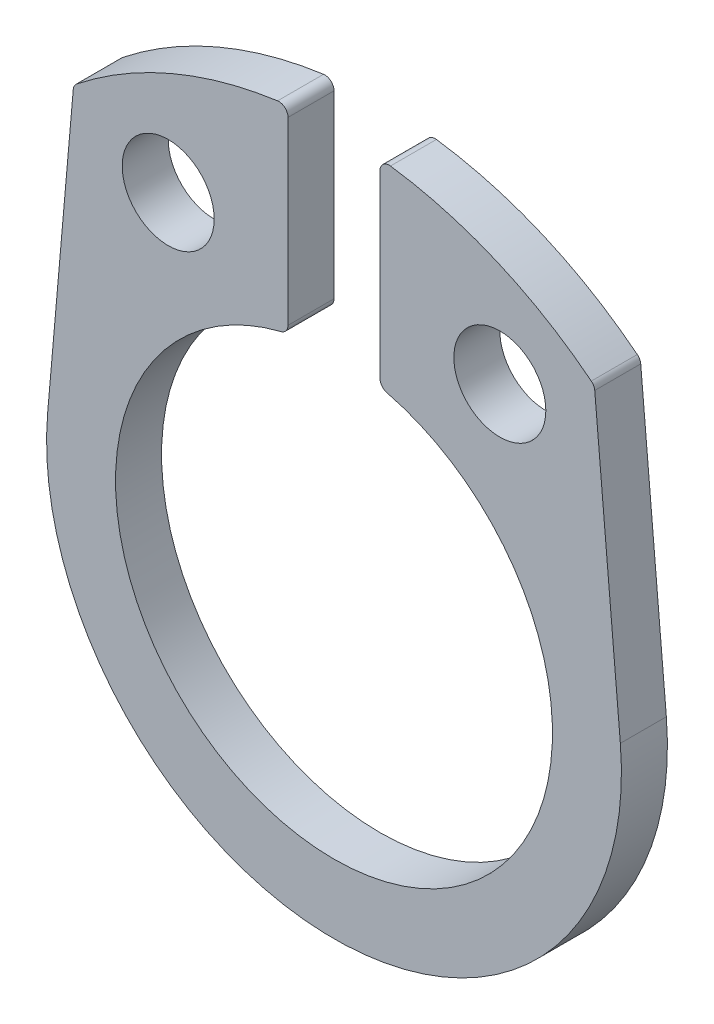
ISO-10303-21;
HEADER;
FILE_DESCRIPTION(('STEP AP214'),'2;1');
FILE_NAME('part.step','',(''),(''),'','','');
FILE_SCHEMA(('AUTOMOTIVE_DESIGN { 1 0 10303 214 1 1 1 1 }'));
ENDSEC;
DATA;
#1=APPLICATION_CONTEXT('core data for automotive mechanical design processes');
#2=APPLICATION_PROTOCOL_DEFINITION('international standard','automotive_design',2000,#1);
#3=PRODUCT_CONTEXT('',#1,'mechanical');
#4=PRODUCT('Part','Part','',(#3));
#5=PRODUCT_RELATED_PRODUCT_CATEGORY('part','',(#4));
#6=PRODUCT_DEFINITION_FORMATION('','',#4);
#7=PRODUCT_DEFINITION_CONTEXT('part definition',#1,'design');
#8=PRODUCT_DEFINITION('design','',#6,#7);
#9=PRODUCT_DEFINITION_SHAPE('','',#8);
#10=(LENGTH_UNIT() NAMED_UNIT(*) SI_UNIT(.MILLI.,.METRE.));
#11=(NAMED_UNIT(*) PLANE_ANGLE_UNIT() SI_UNIT($,.RADIAN.));
#12=(NAMED_UNIT(*) SI_UNIT($,.STERADIAN.) SOLID_ANGLE_UNIT());
#13=UNCERTAINTY_MEASURE_WITH_UNIT(LENGTH_MEASURE(1.E-05),#10,'distance_accuracy_value','');
#14=(GEOMETRIC_REPRESENTATION_CONTEXT(3) GLOBAL_UNCERTAINTY_ASSIGNED_CONTEXT((#13)) GLOBAL_UNIT_ASSIGNED_CONTEXT((#10,
#11,#12)) REPRESENTATION_CONTEXT('',''));
#15=CARTESIAN_POINT('',(0.,0.,0.));
#16=DIRECTION('',(0.,0.,1.));
#17=DIRECTION('',(1.,0.,0.));
#18=AXIS2_PLACEMENT_3D('',#15,#16,#17);
#19=CARTESIAN_POINT('',(0.,0.,0.5));
#20=DIRECTION('',(0.,0.,-1.));
#21=DIRECTION('',(-1.,0.,0.));
#22=AXIS2_PLACEMENT_3D('',#19,#20,#21);
#23=CYLINDRICAL_SURFACE('',#22,9.);
#24=CARTESIAN_POINT('',(0.,0.,0.5));
#25=DIRECTION('',(0.,0.,1.));
#26=DIRECTION('',(1.,0.,0.));
#27=AXIS2_PLACEMENT_3D('',#24,#25,#26);
#28=CIRCLE('',#27,9.);
#29=CARTESIAN_POINT('',(5.59433444537542,7.05006539780207,0.5));
#30=VERTEX_POINT('',#29);
#31=CARTESIAN_POINT('',(1.22727272727273,8.91592965724229,0.5));
#32=VERTEX_POINT('',#31);
#33=EDGE_CURVE('E183',#30,#32,#28,.T.);
#34=ORIENTED_EDGE('',*,*,#33,.F.);
#35=DIRECTION('',(0.,0.,-1.));
#36=VECTOR('',#35,1.);
#37=CARTESIAN_POINT('',(5.59433444537542,7.05006539780208,0.5));
#38=LINE('',#37,#36);
#39=CARTESIAN_POINT('',(5.59433444537542,7.05006539780207,-0.5));
#40=VERTEX_POINT('',#39);
#41=EDGE_CURVE('E219',#30,#40,#38,.T.);
#42=ORIENTED_EDGE('',*,*,#41,.T.);
#43=CARTESIAN_POINT('',(0.,0.,-0.5));
#44=DIRECTION('',(0.,0.,1.));
#45=DIRECTION('',(1.,0.,0.));
#46=AXIS2_PLACEMENT_3D('',#43,#44,#45);
#47=CIRCLE('',#46,9.);
#48=CARTESIAN_POINT('',(1.22727272727273,8.91592965724229,-0.5));
#49=VERTEX_POINT('',#48);
#50=EDGE_CURVE('E162',#40,#49,#47,.T.);
#51=ORIENTED_EDGE('',*,*,#50,.T.);
#52=DIRECTION('',(0.,0.,-1.));
#53=VECTOR('',#52,1.);
#54=CARTESIAN_POINT('',(1.22727272727273,8.91592965724229,0.5));
#55=LINE('',#54,#53);
#56=EDGE_CURVE('E217',#49,#32,#55,.F.);
#57=ORIENTED_EDGE('',*,*,#56,.T.);
#58=EDGE_LOOP('',(#34,#42,#51,#57));
#59=FACE_BOUND('',#58,.T.);
#60=ADVANCED_FACE('F33',(#59),#23,.T.);
#61=CARTESIAN_POINT('',(1.,8.94427190999916,0.5));
#62=DIRECTION('',(1.,0.,0.));
#63=DIRECTION('',(0.,1.,0.));
#64=AXIS2_PLACEMENT_3D('',#61,#62,#63);
#65=PLANE('',#64);
#66=DIRECTION('',(0.,-1.,0.));
#67=VECTOR('',#66,1.);
#68=CARTESIAN_POINT('',(1.,8.94427190999916,-0.5));
#69=LINE('',#68,#67);
#70=CARTESIAN_POINT('',(1.,8.71779788708134,-0.5));
#71=VERTEX_POINT('',#70);
#72=CARTESIAN_POINT('',(1.,4.80234317807464,-0.5));
#73=VERTEX_POINT('',#72);
#74=EDGE_CURVE('E165',#71,#73,#69,.T.);
#75=ORIENTED_EDGE('',*,*,#74,.T.);
#76=DIRECTION('',(0.,0.,-1.));
#77=VECTOR('',#76,1.);
#78=CARTESIAN_POINT('',(1.,4.80234317807464,0.5));
#79=LINE('',#78,#77);
#80=CARTESIAN_POINT('',(1.,4.80234317807464,0.5));
#81=VERTEX_POINT('',#80);
#82=EDGE_CURVE('E204',#73,#81,#79,.F.);
#83=ORIENTED_EDGE('',*,*,#82,.T.);
#84=DIRECTION('',(0.,-1.,0.));
#85=VECTOR('',#84,1.);
#86=CARTESIAN_POINT('',(1.,8.94427190999916,0.5));
#87=LINE('',#86,#85);
#88=CARTESIAN_POINT('',(1.,8.71779788708134,0.5));
#89=VERTEX_POINT('',#88);
#90=EDGE_CURVE('E257',#89,#81,#87,.T.);
#91=ORIENTED_EDGE('',*,*,#90,.F.);
#92=DIRECTION('',(0.,0.,-1.));
#93=VECTOR('',#92,1.);
#94=CARTESIAN_POINT('',(1.,8.71779788708134,0.5));
#95=LINE('',#94,#93);
#96=EDGE_CURVE('E201',#89,#71,#95,.T.);
#97=ORIENTED_EDGE('',*,*,#96,.T.);
#98=EDGE_LOOP('',(#75,#83,#91,#97));
#99=FACE_BOUND('',#98,.T.);
#100=ADVANCED_FACE('F298',(#99),#65,.F.);
#101=CARTESIAN_POINT('',(0.,0.,0.5));
#102=DIRECTION('',(0.,0.,-1.));
#103=DIRECTION('',(-1.,0.,0.));
#104=AXIS2_PLACEMENT_3D('',#101,#102,#103);
#105=CYLINDRICAL_SURFACE('',#104,4.75);
#106=CARTESIAN_POINT('',(0.,0.,0.5));
#107=DIRECTION('',(0.,0.,-1.));
#108=DIRECTION('',(1.,0.,0.));
#109=AXIS2_PLACEMENT_3D('',#106,#107,#108);
#110=CIRCLE('',#109,4.75);
#111=CARTESIAN_POINT('',(1.15151515151515,4.60830911027364,0.5));
#112=VERTEX_POINT('',#111);
#113=CARTESIAN_POINT('',(-1.15151515151515,4.60830911027364,0.5));
#114=VERTEX_POINT('',#113);
#115=EDGE_CURVE('E243',#112,#114,#110,.T.);
#116=ORIENTED_EDGE('',*,*,#115,.F.);
#117=DIRECTION('',(0.,0.,-1.));
#118=VECTOR('',#117,1.);
#119=CARTESIAN_POINT('',(1.15151515151515,4.60830911027364,0.5));
#120=LINE('',#119,#118);
#121=CARTESIAN_POINT('',(1.15151515151515,4.60830911027364,-0.5));
#122=VERTEX_POINT('',#121);
#123=EDGE_CURVE('E186',#112,#122,#120,.T.);
#124=ORIENTED_EDGE('',*,*,#123,.T.);
#125=CARTESIAN_POINT('',(0.,0.,-0.5));
#126=DIRECTION('',(0.,0.,-1.));
#127=DIRECTION('',(1.,0.,0.));
#128=AXIS2_PLACEMENT_3D('',#125,#126,#127);
#129=CIRCLE('',#128,4.75);
#130=CARTESIAN_POINT('',(-1.15151515151515,4.60830911027364,-0.5));
#131=VERTEX_POINT('',#130);
#132=EDGE_CURVE('E169',#122,#131,#129,.T.);
#133=ORIENTED_EDGE('',*,*,#132,.T.);
#134=DIRECTION('',(0.,0.,-1.));
#135=VECTOR('',#134,1.);
#136=CARTESIAN_POINT('',(-1.15151515151515,4.60830911027364,0.5));
#137=LINE('',#136,#135);
#138=EDGE_CURVE('E152',#131,#114,#137,.F.);
#139=ORIENTED_EDGE('',*,*,#138,.T.);
#140=EDGE_LOOP('',(#116,#124,#133,#139));
#141=FACE_BOUND('',#140,.T.);
#142=ADVANCED_FACE('F304',(#141),#105,.F.);
#143=CARTESIAN_POINT('',(-1.,8.94427190999916,0.5));
#144=DIRECTION('',(-1.,0.,0.));
#145=DIRECTION('',(0.,-1.,0.));
#146=AXIS2_PLACEMENT_3D('',#143,#144,#145);
#147=PLANE('',#146);
#148=DIRECTION('',(0.,1.,0.));
#149=VECTOR('',#148,1.);
#150=CARTESIAN_POINT('',(-1.,8.94427190999916,-0.5));
#151=LINE('',#150,#149);
#152=CARTESIAN_POINT('',(-1.,4.80234317807464,-0.5));
#153=VERTEX_POINT('',#152);
#154=CARTESIAN_POINT('',(-1.,8.71779788708134,-0.5));
#155=VERTEX_POINT('',#154);
#156=EDGE_CURVE('E172',#153,#155,#151,.T.);
#157=ORIENTED_EDGE('',*,*,#156,.T.);
#158=DIRECTION('',(0.,0.,-1.));
#159=VECTOR('',#158,1.);
#160=CARTESIAN_POINT('',(-1.,8.71779788708134,0.5));
#161=LINE('',#160,#159);
#162=CARTESIAN_POINT('',(-1.,8.71779788708134,0.5));
#163=VERTEX_POINT('',#162);
#164=EDGE_CURVE('E41',#155,#163,#161,.F.);
#165=ORIENTED_EDGE('',*,*,#164,.T.);
#166=DIRECTION('',(0.,1.,0.));
#167=VECTOR('',#166,1.);
#168=CARTESIAN_POINT('',(-1.,8.94427190999916,0.5));
#169=LINE('',#168,#167);
#170=CARTESIAN_POINT('',(-1.,4.80234317807464,0.5));
#171=VERTEX_POINT('',#170);
#172=EDGE_CURVE('E235',#171,#163,#169,.T.);
#173=ORIENTED_EDGE('',*,*,#172,.F.);
#174=DIRECTION('',(0.,0.,-1.));
#175=VECTOR('',#174,1.);
#176=CARTESIAN_POINT('',(-1.,4.80234317807464,0.5));
#177=LINE('',#176,#175);
#178=EDGE_CURVE('E228',#171,#153,#177,.T.);
#179=ORIENTED_EDGE('',*,*,#178,.T.);
#180=EDGE_LOOP('',(#157,#165,#173,#179));
#181=FACE_BOUND('',#180,.T.);
#182=ADVANCED_FACE('F234',(#181),#147,.F.);
#183=CARTESIAN_POINT('',(0.,0.,0.5));
#184=DIRECTION('',(0.,0.,-1.));
#185=DIRECTION('',(-1.,0.,0.));
#186=AXIS2_PLACEMENT_3D('',#183,#184,#185);
#187=CYLINDRICAL_SURFACE('',#186,9.);
#188=CARTESIAN_POINT('',(0.,0.,0.5));
#189=DIRECTION('',(0.,0.,1.));
#190=DIRECTION('',(1.,0.,0.));
#191=AXIS2_PLACEMENT_3D('',#188,#189,#190);
#192=CIRCLE('',#191,9.);
#193=CARTESIAN_POINT('',(-1.22727272727273,8.91592965724229,0.5));
#194=VERTEX_POINT('',#193);
#195=CARTESIAN_POINT('',(-5.59433444537542,7.05006539780207,0.5));
#196=VERTEX_POINT('',#195);
#197=EDGE_CURVE('E143',#194,#196,#192,.T.);
#198=ORIENTED_EDGE('',*,*,#197,.F.);
#199=DIRECTION('',(0.,0.,-1.));
#200=VECTOR('',#199,1.);
#201=CARTESIAN_POINT('',(-1.22727272727273,8.91592965724229,0.5));
#202=LINE('',#201,#200);
#203=CARTESIAN_POINT('',(-1.22727272727273,8.91592965724229,-0.5));
#204=VERTEX_POINT('',#203);
#205=EDGE_CURVE('E225',#194,#204,#202,.T.);
#206=ORIENTED_EDGE('',*,*,#205,.T.);
#207=CARTESIAN_POINT('',(0.,0.,-0.5));
#208=DIRECTION('',(0.,0.,1.));
#209=DIRECTION('',(1.,0.,0.));
#210=AXIS2_PLACEMENT_3D('',#207,#208,#209);
#211=CIRCLE('',#210,9.);
#212=CARTESIAN_POINT('',(-5.59433444537542,7.05006539780207,-0.5));
#213=VERTEX_POINT('',#212);
#214=EDGE_CURVE('E175',#204,#213,#211,.T.);
#215=ORIENTED_EDGE('',*,*,#214,.T.);
#216=DIRECTION('',(0.,0.,-1.));
#217=VECTOR('',#216,1.);
#218=CARTESIAN_POINT('',(-5.59433444537542,7.05006539780207,0.5));
#219=LINE('',#218,#217);
#220=EDGE_CURVE('E223',#213,#196,#219,.F.);
#221=ORIENTED_EDGE('',*,*,#220,.T.);
#222=EDGE_LOOP('',(#198,#206,#215,#221));
#223=FACE_BOUND('',#222,.T.);
#224=ADVANCED_FACE('F249',(#223),#187,.T.);
#225=CARTESIAN_POINT('',(-5.66180351363416,6.99599749664048,0.5));
#226=DIRECTION('',(0.996194698091746,-0.0871557427476545,0.));
#227=DIRECTION('',(0.0871557427476546,0.996194698091746,0.));
#228=AXIS2_PLACEMENT_3D('',#225,#226,#227);
#229=PLANE('',#228);
#230=DIRECTION('',(-0.0871557427476545,-0.996194698091746,0.));
#231=VECTOR('',#230,1.);
#232=CARTESIAN_POINT('',(-5.66180351363416,6.99599749664048,0.5));
#233=LINE('',#232,#231);
#234=CARTESIAN_POINT('',(-5.66925484176321,6.91082842640044,0.5));
#235=VERTEX_POINT('',#234);
#236=CARTESIAN_POINT('',(-6.22621686307341,0.544723392172842,0.5));
#237=VERTEX_POINT('',#236);
#238=EDGE_CURVE('E134',#235,#237,#233,.T.);
#239=ORIENTED_EDGE('',*,*,#238,.F.);
#240=DIRECTION('',(0.,0.,-1.));
#241=VECTOR('',#240,1.);
#242=CARTESIAN_POINT('',(-5.66925484176321,6.91082842640044,0.5));
#243=LINE('',#242,#241);
#244=CARTESIAN_POINT('',(-5.66925484176321,6.91082842640044,-0.5));
#245=VERTEX_POINT('',#244);
#246=EDGE_CURVE('E11',#235,#245,#243,.T.);
#247=ORIENTED_EDGE('',*,*,#246,.T.);
#248=DIRECTION('',(-0.0871557427476545,-0.996194698091746,0.));
#249=VECTOR('',#248,1.);
#250=CARTESIAN_POINT('',(-5.66180351363416,6.99599749664048,-0.5));
#251=LINE('',#250,#249);
#252=CARTESIAN_POINT('',(-6.22621686307341,0.544723392172842,-0.5));
#253=VERTEX_POINT('',#252);
#254=EDGE_CURVE('E149',#245,#253,#251,.T.);
#255=ORIENTED_EDGE('',*,*,#254,.T.);
#256=DIRECTION('',(0.,0.,-1.));
#257=VECTOR('',#256,1.);
#258=CARTESIAN_POINT('',(-6.22621686307341,0.544723392172842,0.5));
#259=LINE('',#258,#257);
#260=EDGE_CURVE('E146',#237,#253,#259,.T.);
#261=ORIENTED_EDGE('',*,*,#260,.F.);
#262=EDGE_LOOP('',(#239,#247,#255,#261));
#263=FACE_BOUND('',#262,.T.);
#264=ADVANCED_FACE('F147',(#263),#229,.F.);
#265=CARTESIAN_POINT('',(0.,0.,0.5));
#266=DIRECTION('',(0.,0.,-1.));
#267=DIRECTION('',(-1.,0.,0.));
#268=AXIS2_PLACEMENT_3D('',#265,#266,#267);
#269=CYLINDRICAL_SURFACE('',#268,6.25);
#270=CARTESIAN_POINT('',(0.,0.,-0.5));
#271=DIRECTION('',(0.,0.,1.));
#272=DIRECTION('',(1.,0.,0.));
#273=AXIS2_PLACEMENT_3D('',#270,#271,#272);
#274=CIRCLE('',#273,6.25);
#275=CARTESIAN_POINT('',(6.22621686307341,0.544723392172844,-0.5));
#276=VERTEX_POINT('',#275);
#277=EDGE_CURVE('E179',#253,#276,#274,.T.);
#278=ORIENTED_EDGE('',*,*,#277,.T.);
#279=DIRECTION('',(0.,0.,-1.));
#280=VECTOR('',#279,1.);
#281=CARTESIAN_POINT('',(6.22621686307341,0.544723392172844,0.5));
#282=LINE('',#281,#280);
#283=CARTESIAN_POINT('',(6.22621686307341,0.544723392172844,0.5));
#284=VERTEX_POINT('',#283);
#285=EDGE_CURVE('E153',#284,#276,#282,.T.);
#286=ORIENTED_EDGE('',*,*,#285,.F.);
#287=CARTESIAN_POINT('',(0.,0.,0.5));
#288=DIRECTION('',(0.,0.,1.));
#289=DIRECTION('',(1.,0.,0.));
#290=AXIS2_PLACEMENT_3D('',#287,#288,#289);
#291=CIRCLE('',#290,6.25);
#292=EDGE_CURVE('E139',#237,#284,#291,.T.);
#293=ORIENTED_EDGE('',*,*,#292,.F.);
#294=ORIENTED_EDGE('',*,*,#260,.T.);
#295=EDGE_LOOP('',(#278,#286,#293,#294));
#296=FACE_BOUND('',#295,.T.);
#297=ADVANCED_FACE('F155',(#296),#269,.T.);
#298=CARTESIAN_POINT('',(6.22621686307341,0.544723392172844,0.5));
#299=DIRECTION('',(-0.996194698091746,-0.0871557427476551,0.));
#300=DIRECTION('',(0.0871557427476551,-0.996194698091746,0.));
#301=AXIS2_PLACEMENT_3D('',#298,#299,#300);
#302=PLANE('',#301);
#303=DIRECTION('',(-0.0871557427476551,0.996194698091746,0.));
#304=VECTOR('',#303,1.);
#305=CARTESIAN_POINT('',(6.22621686307341,0.544723392172844,-0.5));
#306=LINE('',#305,#304);
#307=CARTESIAN_POINT('',(5.6692548417632,6.91082842640045,-0.5));
#308=VERTEX_POINT('',#307);
#309=EDGE_CURVE('E181',#276,#308,#306,.T.);
#310=ORIENTED_EDGE('',*,*,#309,.T.);
#311=DIRECTION('',(0.,0.,-1.));
#312=VECTOR('',#311,1.);
#313=CARTESIAN_POINT('',(5.6692548417632,6.91082842640045,0.5));
#314=LINE('',#313,#312);
#315=CARTESIAN_POINT('',(5.6692548417632,6.91082842640045,0.5));
#316=VERTEX_POINT('',#315);
#317=EDGE_CURVE('E48',#308,#316,#314,.F.);
#318=ORIENTED_EDGE('',*,*,#317,.T.);
#319=DIRECTION('',(-0.0871557427476551,0.996194698091746,0.));
#320=VECTOR('',#319,1.);
#321=CARTESIAN_POINT('',(6.22621686307341,0.544723392172844,0.5));
#322=LINE('',#321,#320);
#323=EDGE_CURVE('E157',#284,#316,#322,.T.);
#324=ORIENTED_EDGE('',*,*,#323,.F.);
#325=ORIENTED_EDGE('',*,*,#285,.T.);
#326=EDGE_LOOP('',(#310,#318,#324,#325));
#327=FACE_BOUND('',#326,.T.);
#328=ADVANCED_FACE('F285',(#327),#302,.F.);
#329=CARTESIAN_POINT('',(0.,0.,0.5));
#330=DIRECTION('',(0.,0.,1.));
#331=DIRECTION('',(1.,0.,0.));
#332=AXIS2_PLACEMENT_3D('',#329,#330,#331);
#333=PLANE('',#332);
#334=CARTESIAN_POINT('',(-3.60555127546399,6.,0.5));
#335=DIRECTION('',(0.,0.,1.));
#336=DIRECTION('',(1.,0.,0.));
#337=AXIS2_PLACEMENT_3D('',#334,#335,#336);
#338=CIRCLE('',#337,1.);
#339=CARTESIAN_POINT('',(-2.60555127546399,6.,0.5));
#340=VERTEX_POINT('',#339);
#341=EDGE_CURVE('E267',#340,#340,#338,.T.);
#342=ORIENTED_EDGE('',*,*,#341,.F.);
#343=EDGE_LOOP('',(#342));
#344=FACE_BOUND('',#343,.T.);
#345=CARTESIAN_POINT('',(3.60555127546399,6.,0.5));
#346=DIRECTION('',(0.,0.,1.));
#347=DIRECTION('',(1.,0.,0.));
#348=AXIS2_PLACEMENT_3D('',#345,#346,#347);
#349=CIRCLE('',#348,1.);
#350=CARTESIAN_POINT('',(4.60555127546399,6.,0.5));
#351=VERTEX_POINT('',#350);
#352=EDGE_CURVE('E261',#351,#351,#349,.T.);
#353=ORIENTED_EDGE('',*,*,#352,.F.);
#354=EDGE_LOOP('',(#353));
#355=FACE_BOUND('',#354,.T.);
#356=ORIENTED_EDGE('',*,*,#90,.T.);
#357=CARTESIAN_POINT('',(1.2,4.80234317807464,0.5));
#358=DIRECTION('',(0.,0.,1.));
#359=DIRECTION('',(1.,0.,0.));
#360=AXIS2_PLACEMENT_3D('',#357,#358,#359);
#361=CIRCLE('',#360,0.2);
#362=EDGE_CURVE('E215',#81,#112,#361,.T.);
#363=ORIENTED_EDGE('',*,*,#362,.T.);
#364=ORIENTED_EDGE('',*,*,#115,.T.);
#365=CARTESIAN_POINT('',(-1.2,4.80234317807464,0.5));
#366=DIRECTION('',(0.,0.,1.));
#367=DIRECTION('',(1.,0.,0.));
#368=AXIS2_PLACEMENT_3D('',#365,#366,#367);
#369=CIRCLE('',#368,0.2);
#370=EDGE_CURVE('E207',#114,#171,#369,.T.);
#371=ORIENTED_EDGE('',*,*,#370,.T.);
#372=ORIENTED_EDGE('',*,*,#172,.T.);
#373=CARTESIAN_POINT('',(-1.2,8.71779788708134,0.5));
#374=DIRECTION('',(0.,0.,1.));
#375=DIRECTION('',(1.,0.,0.));
#376=AXIS2_PLACEMENT_3D('',#373,#374,#375);
#377=CIRCLE('',#376,0.2);
#378=EDGE_CURVE('E209',#163,#194,#377,.T.);
#379=ORIENTED_EDGE('',*,*,#378,.T.);
#380=ORIENTED_EDGE('',*,*,#197,.T.);
#381=CARTESIAN_POINT('',(-5.47001590214485,6.89339727785091,0.5));
#382=DIRECTION('',(0.,0.,1.));
#383=DIRECTION('',(1.,0.,0.));
#384=AXIS2_PLACEMENT_3D('',#381,#382,#383);
#385=CIRCLE('',#384,0.2);
#386=EDGE_CURVE('E56',#196,#235,#385,.T.);
#387=ORIENTED_EDGE('',*,*,#386,.T.);
#388=ORIENTED_EDGE('',*,*,#238,.T.);
#389=ORIENTED_EDGE('',*,*,#292,.T.);
#390=ORIENTED_EDGE('',*,*,#323,.T.);
#391=CARTESIAN_POINT('',(5.47001590214485,6.89339727785091,0.5));
#392=DIRECTION('',(0.,0.,1.));
#393=DIRECTION('',(1.,0.,0.));
#394=AXIS2_PLACEMENT_3D('',#391,#392,#393);
#395=CIRCLE('',#394,0.2);
#396=EDGE_CURVE('E213',#316,#30,#395,.T.);
#397=ORIENTED_EDGE('',*,*,#396,.T.);
#398=ORIENTED_EDGE('',*,*,#33,.T.);
#399=CARTESIAN_POINT('',(1.2,8.71779788708134,0.5));
#400=DIRECTION('',(0.,0.,1.));
#401=DIRECTION('',(1.,0.,0.));
#402=AXIS2_PLACEMENT_3D('',#399,#400,#401);
#403=CIRCLE('',#402,0.2);
#404=EDGE_CURVE('E211',#32,#89,#403,.T.);
#405=ORIENTED_EDGE('',*,*,#404,.T.);
#406=EDGE_LOOP('',(#356,#363,#364,#371,#372,#379,#380,#387,#388,#389,#390,#397,#398,#405));
#407=FACE_BOUND('',#406,.T.);
#408=ADVANCED_FACE('F137',(#344,#355,#407),#333,.T.);
#409=CARTESIAN_POINT('',(0.,0.,-0.5));
#410=DIRECTION('',(0.,0.,1.));
#411=DIRECTION('',(1.,0.,0.));
#412=AXIS2_PLACEMENT_3D('',#409,#410,#411);
#413=PLANE('',#412);
#414=CARTESIAN_POINT('',(-3.60555127546399,6.,-0.5));
#415=DIRECTION('',(0.,0.,1.));
#416=DIRECTION('',(1.,0.,0.));
#417=AXIS2_PLACEMENT_3D('',#414,#415,#416);
#418=CIRCLE('',#417,1.);
#419=CARTESIAN_POINT('',(-2.60555127546399,6.,-0.5));
#420=VERTEX_POINT('',#419);
#421=EDGE_CURVE('E166',#420,#420,#418,.T.);
#422=ORIENTED_EDGE('',*,*,#421,.T.);
#423=EDGE_LOOP('',(#422));
#424=FACE_BOUND('',#423,.T.);
#425=CARTESIAN_POINT('',(3.60555127546399,6.,-0.5));
#426=DIRECTION('',(0.,0.,1.));
#427=DIRECTION('',(1.,0.,0.));
#428=AXIS2_PLACEMENT_3D('',#425,#426,#427);
#429=CIRCLE('',#428,1.);
#430=CARTESIAN_POINT('',(4.60555127546399,6.,-0.5));
#431=VERTEX_POINT('',#430);
#432=EDGE_CURVE('E264',#431,#431,#429,.T.);
#433=ORIENTED_EDGE('',*,*,#432,.T.);
#434=EDGE_LOOP('',(#433));
#435=FACE_BOUND('',#434,.T.);
#436=ORIENTED_EDGE('',*,*,#132,.F.);
#437=CARTESIAN_POINT('',(1.2,4.80234317807464,-0.5));
#438=DIRECTION('',(0.,0.,1.));
#439=DIRECTION('',(1.,0.,0.));
#440=AXIS2_PLACEMENT_3D('',#437,#438,#439);
#441=CIRCLE('',#440,0.2);
#442=EDGE_CURVE('E199',#122,#73,#441,.F.);
#443=ORIENTED_EDGE('',*,*,#442,.T.);
#444=ORIENTED_EDGE('',*,*,#74,.F.);
#445=CARTESIAN_POINT('',(1.2,8.71779788708134,-0.5));
#446=DIRECTION('',(0.,0.,1.));
#447=DIRECTION('',(1.,0.,0.));
#448=AXIS2_PLACEMENT_3D('',#445,#446,#447);
#449=CIRCLE('',#448,0.2);
#450=EDGE_CURVE('E195',#71,#49,#449,.F.);
#451=ORIENTED_EDGE('',*,*,#450,.T.);
#452=ORIENTED_EDGE('',*,*,#50,.F.);
#453=CARTESIAN_POINT('',(5.47001590214485,6.89339727785091,-0.5));
#454=DIRECTION('',(0.,0.,1.));
#455=DIRECTION('',(1.,0.,0.));
#456=AXIS2_PLACEMENT_3D('',#453,#454,#455);
#457=CIRCLE('',#456,0.2);
#458=EDGE_CURVE('E197',#40,#308,#457,.F.);
#459=ORIENTED_EDGE('',*,*,#458,.T.);
#460=ORIENTED_EDGE('',*,*,#309,.F.);
#461=ORIENTED_EDGE('',*,*,#277,.F.);
#462=ORIENTED_EDGE('',*,*,#254,.F.);
#463=CARTESIAN_POINT('',(-5.47001590214485,6.89339727785091,-0.5));
#464=DIRECTION('',(0.,0.,1.));
#465=DIRECTION('',(1.,0.,0.));
#466=AXIS2_PLACEMENT_3D('',#463,#464,#465);
#467=CIRCLE('',#466,0.2);
#468=EDGE_CURVE('E189',#245,#213,#467,.F.);
#469=ORIENTED_EDGE('',*,*,#468,.T.);
#470=ORIENTED_EDGE('',*,*,#214,.F.);
#471=CARTESIAN_POINT('',(-1.2,8.71779788708134,-0.5));
#472=DIRECTION('',(0.,0.,1.));
#473=DIRECTION('',(1.,0.,0.));
#474=AXIS2_PLACEMENT_3D('',#471,#472,#473);
#475=CIRCLE('',#474,0.2);
#476=EDGE_CURVE('E193',#204,#155,#475,.F.);
#477=ORIENTED_EDGE('',*,*,#476,.T.);
#478=ORIENTED_EDGE('',*,*,#156,.F.);
#479=CARTESIAN_POINT('',(-1.2,4.80234317807464,-0.5));
#480=DIRECTION('',(0.,0.,1.));
#481=DIRECTION('',(1.,0.,0.));
#482=AXIS2_PLACEMENT_3D('',#479,#480,#481);
#483=CIRCLE('',#482,0.2);
#484=EDGE_CURVE('E191',#153,#131,#483,.F.);
#485=ORIENTED_EDGE('',*,*,#484,.T.);
#486=EDGE_LOOP('',(#436,#443,#444,#451,#452,#459,#460,#461,#462,#469,#470,#477,#478,#485));
#487=FACE_BOUND('',#486,.T.);
#488=ADVANCED_FACE('F253',(#424,#435,#487),#413,.F.);
#489=CARTESIAN_POINT('',(3.60555127546399,6.,-0.5));
#490=DIRECTION('',(0.,0.,1.));
#491=DIRECTION('',(1.,0.,0.));
#492=AXIS2_PLACEMENT_3D('',#489,#490,#491);
#493=CYLINDRICAL_SURFACE('',#492,1.);
#494=ORIENTED_EDGE('',*,*,#432,.F.);
#495=EDGE_LOOP('',(#494));
#496=FACE_BOUND('',#495,.T.);
#497=ORIENTED_EDGE('',*,*,#352,.T.);
#498=EDGE_LOOP('',(#497));
#499=FACE_BOUND('',#498,.T.);
#500=ADVANCED_FACE('F279',(#496,#499),#493,.F.);
#501=CARTESIAN_POINT('',(-3.60555127546399,6.,-0.5));
#502=DIRECTION('',(0.,0.,1.));
#503=DIRECTION('',(1.,0.,0.));
#504=AXIS2_PLACEMENT_3D('',#501,#502,#503);
#505=CYLINDRICAL_SURFACE('',#504,1.);
#506=ORIENTED_EDGE('',*,*,#421,.F.);
#507=EDGE_LOOP('',(#506));
#508=FACE_BOUND('',#507,.T.);
#509=ORIENTED_EDGE('',*,*,#341,.T.);
#510=EDGE_LOOP('',(#509));
#511=FACE_BOUND('',#510,.T.);
#512=ADVANCED_FACE('F275',(#508,#511),#505,.F.);
#513=CARTESIAN_POINT('',(1.2,4.80234317807464,0.5));
#514=DIRECTION('',(0.,0.,-1.));
#515=DIRECTION('',(-1.,0.,0.));
#516=AXIS2_PLACEMENT_3D('',#513,#514,#515);
#517=CYLINDRICAL_SURFACE('',#516,0.2);
#518=ORIENTED_EDGE('',*,*,#362,.F.);
#519=ORIENTED_EDGE('',*,*,#82,.F.);
#520=ORIENTED_EDGE('',*,*,#442,.F.);
#521=ORIENTED_EDGE('',*,*,#123,.F.);
#522=EDGE_LOOP('',(#518,#519,#520,#521));
#523=FACE_BOUND('',#522,.T.);
#524=ADVANCED_FACE('F278',(#523),#517,.T.);
#525=CARTESIAN_POINT('',(5.47001590214485,6.89339727785091,0.5));
#526=DIRECTION('',(0.,0.,-1.));
#527=DIRECTION('',(-1.,0.,0.));
#528=AXIS2_PLACEMENT_3D('',#525,#526,#527);
#529=CYLINDRICAL_SURFACE('',#528,0.2);
#530=ORIENTED_EDGE('',*,*,#396,.F.);
#531=ORIENTED_EDGE('',*,*,#317,.F.);
#532=ORIENTED_EDGE('',*,*,#458,.F.);
#533=ORIENTED_EDGE('',*,*,#41,.F.);
#534=EDGE_LOOP('',(#530,#531,#532,#533));
#535=FACE_BOUND('',#534,.T.);
#536=ADVANCED_FACE('F312',(#535),#529,.T.);
#537=CARTESIAN_POINT('',(1.2,8.71779788708134,0.5));
#538=DIRECTION('',(0.,0.,-1.));
#539=DIRECTION('',(-1.,0.,0.));
#540=AXIS2_PLACEMENT_3D('',#537,#538,#539);
#541=CYLINDRICAL_SURFACE('',#540,0.2);
#542=ORIENTED_EDGE('',*,*,#404,.F.);
#543=ORIENTED_EDGE('',*,*,#56,.F.);
#544=ORIENTED_EDGE('',*,*,#450,.F.);
#545=ORIENTED_EDGE('',*,*,#96,.F.);
#546=EDGE_LOOP('',(#542,#543,#544,#545));
#547=FACE_BOUND('',#546,.T.);
#548=ADVANCED_FACE('F316',(#547),#541,.T.);
#549=CARTESIAN_POINT('',(-1.2,8.71779788708134,0.5));
#550=DIRECTION('',(0.,0.,-1.));
#551=DIRECTION('',(-1.,0.,0.));
#552=AXIS2_PLACEMENT_3D('',#549,#550,#551);
#553=CYLINDRICAL_SURFACE('',#552,0.2);
#554=ORIENTED_EDGE('',*,*,#378,.F.);
#555=ORIENTED_EDGE('',*,*,#164,.F.);
#556=ORIENTED_EDGE('',*,*,#476,.F.);
#557=ORIENTED_EDGE('',*,*,#205,.F.);
#558=EDGE_LOOP('',(#554,#555,#556,#557));
#559=FACE_BOUND('',#558,.T.);
#560=ADVANCED_FACE('F246',(#559),#553,.T.);
#561=CARTESIAN_POINT('',(-1.2,4.80234317807464,0.5));
#562=DIRECTION('',(0.,0.,-1.));
#563=DIRECTION('',(-1.,0.,0.));
#564=AXIS2_PLACEMENT_3D('',#561,#562,#563);
#565=CYLINDRICAL_SURFACE('',#564,0.2);
#566=ORIENTED_EDGE('',*,*,#370,.F.);
#567=ORIENTED_EDGE('',*,*,#138,.F.);
#568=ORIENTED_EDGE('',*,*,#484,.F.);
#569=ORIENTED_EDGE('',*,*,#178,.F.);
#570=EDGE_LOOP('',(#566,#567,#568,#569));
#571=FACE_BOUND('',#570,.T.);
#572=ADVANCED_FACE('F322',(#571),#565,.T.);
#573=CARTESIAN_POINT('',(-5.47001590214485,6.89339727785091,0.5));
#574=DIRECTION('',(0.,0.,-1.));
#575=DIRECTION('',(-1.,0.,0.));
#576=AXIS2_PLACEMENT_3D('',#573,#574,#575);
#577=CYLINDRICAL_SURFACE('',#576,0.2);
#578=ORIENTED_EDGE('',*,*,#386,.F.);
#579=ORIENTED_EDGE('',*,*,#220,.F.);
#580=ORIENTED_EDGE('',*,*,#468,.F.);
#581=ORIENTED_EDGE('',*,*,#246,.F.);
#582=EDGE_LOOP('',(#578,#579,#580,#581));
#583=FACE_BOUND('',#582,.T.);
#584=ADVANCED_FACE('F35',(#583),#577,.T.);
#585=CLOSED_SHELL('',(#60,#100,#142,#182,#224,#264,#297,#328,#408,#488,#500,#512,#524,#536,#548,
#560,#572,#584));
#586=MANIFOLD_SOLID_BREP('B2',#585);
#587=ADVANCED_BREP_SHAPE_REPRESENTATION('',(#18,#586),#14);
#588=SHAPE_DEFINITION_REPRESENTATION(#9,#587);
ENDSEC;
END-ISO-10303-21;
